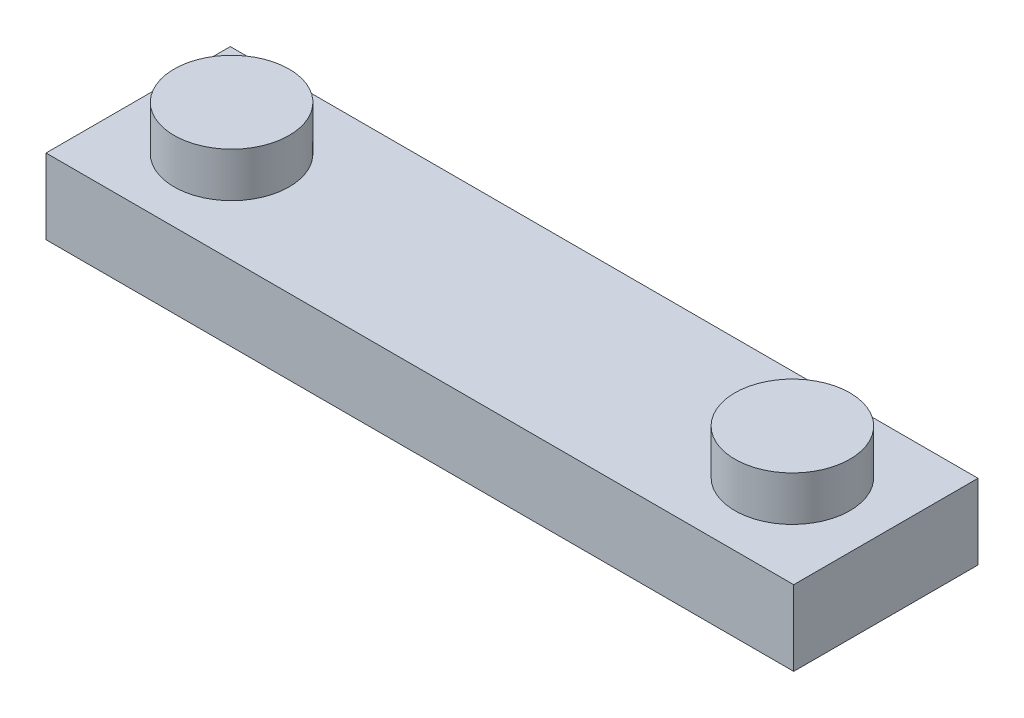
ISO-10303-21;
HEADER;
FILE_DESCRIPTION(('STEP AP214'),'2;1');
FILE_NAME('part.step','',(''),(''),'','','');
FILE_SCHEMA(('AUTOMOTIVE_DESIGN { 1 0 10303 214 1 1 1 1 }'));
ENDSEC;
DATA;
#1=APPLICATION_CONTEXT('core data for automotive mechanical design processes');
#2=APPLICATION_PROTOCOL_DEFINITION('international standard','automotive_design',2000,#1);
#3=PRODUCT_CONTEXT('',#1,'mechanical');
#4=PRODUCT('Part','Part','',(#3));
#5=PRODUCT_RELATED_PRODUCT_CATEGORY('part','',(#4));
#6=PRODUCT_DEFINITION_FORMATION('','',#4);
#7=PRODUCT_DEFINITION_CONTEXT('part definition',#1,'design');
#8=PRODUCT_DEFINITION('design','',#6,#7);
#9=PRODUCT_DEFINITION_SHAPE('','',#8);
#10=(LENGTH_UNIT() NAMED_UNIT(*) SI_UNIT(.MILLI.,.METRE.));
#11=(NAMED_UNIT(*) PLANE_ANGLE_UNIT() SI_UNIT($,.RADIAN.));
#12=(NAMED_UNIT(*) SI_UNIT($,.STERADIAN.) SOLID_ANGLE_UNIT());
#13=UNCERTAINTY_MEASURE_WITH_UNIT(LENGTH_MEASURE(1.E-05),#10,'distance_accuracy_value','');
#14=(GEOMETRIC_REPRESENTATION_CONTEXT(3) GLOBAL_UNCERTAINTY_ASSIGNED_CONTEXT((#13)) GLOBAL_UNIT_ASSIGNED_CONTEXT((#10,
#11,#12)) REPRESENTATION_CONTEXT('',''));
#15=CARTESIAN_POINT('',(0.,0.,0.));
#16=DIRECTION('',(0.,0.,1.));
#17=DIRECTION('',(1.,0.,0.));
#18=AXIS2_PLACEMENT_3D('',#15,#16,#17);
#19=CARTESIAN_POINT('',(15.925,-3.2,-3.925));
#20=DIRECTION('',(1.,0.,0.));
#21=DIRECTION('',(0.,0.,-1.));
#22=AXIS2_PLACEMENT_3D('',#19,#20,#21);
#23=PLANE('',#22);
#24=DIRECTION('',(0.,0.,-1.));
#25=VECTOR('',#24,1.);
#26=CARTESIAN_POINT('',(15.925,0.,-3.925));
#27=LINE('',#26,#25);
#28=CARTESIAN_POINT('',(15.925,0.,3.925));
#29=VERTEX_POINT('',#28);
#30=CARTESIAN_POINT('',(15.925,0.,-3.925));
#31=VERTEX_POINT('',#30);
#32=EDGE_CURVE('E171',#29,#31,#27,.T.);
#33=ORIENTED_EDGE('',*,*,#32,.F.);
#34=DIRECTION('',(0.,1.,0.));
#35=VECTOR('',#34,1.);
#36=CARTESIAN_POINT('',(15.925,-3.2,3.925));
#37=LINE('',#36,#35);
#38=CARTESIAN_POINT('',(15.925,-3.2,3.925));
#39=VERTEX_POINT('',#38);
#40=EDGE_CURVE('E58',#39,#29,#37,.T.);
#41=ORIENTED_EDGE('',*,*,#40,.F.);
#42=DIRECTION('',(0.,0.,-1.));
#43=VECTOR('',#42,1.);
#44=CARTESIAN_POINT('',(15.925,-3.2,-3.925));
#45=LINE('',#44,#43);
#46=CARTESIAN_POINT('',(15.925,-3.2,-3.925));
#47=VERTEX_POINT('',#46);
#48=EDGE_CURVE('E174',#39,#47,#45,.T.);
#49=ORIENTED_EDGE('',*,*,#48,.T.);
#50=DIRECTION('',(0.,1.,0.));
#51=VECTOR('',#50,1.);
#52=CARTESIAN_POINT('',(15.925,-3.2,-3.925));
#53=LINE('',#52,#51);
#54=EDGE_CURVE('E84',#47,#31,#53,.T.);
#55=ORIENTED_EDGE('',*,*,#54,.T.);
#56=EDGE_LOOP('',(#33,#41,#49,#55));
#57=FACE_BOUND('',#56,.T.);
#58=ADVANCED_FACE('F35',(#57),#23,.T.);
#59=CARTESIAN_POINT('',(-15.925,-3.2,3.925));
#60=DIRECTION('',(0.,0.,1.));
#61=DIRECTION('',(1.,0.,0.));
#62=AXIS2_PLACEMENT_3D('',#59,#60,#61);
#63=PLANE('',#62);
#64=DIRECTION('',(1.,0.,0.));
#65=VECTOR('',#64,1.);
#66=CARTESIAN_POINT('',(-15.925,0.,3.925));
#67=LINE('',#66,#65);
#68=CARTESIAN_POINT('',(-15.925,0.,3.925));
#69=VERTEX_POINT('',#68);
#70=EDGE_CURVE('E177',#69,#29,#67,.T.);
#71=ORIENTED_EDGE('',*,*,#70,.F.);
#72=DIRECTION('',(0.,1.,0.));
#73=VECTOR('',#72,1.);
#74=CARTESIAN_POINT('',(-15.925,-3.2,3.925));
#75=LINE('',#74,#73);
#76=CARTESIAN_POINT('',(-15.925,-3.2,3.925));
#77=VERTEX_POINT('',#76);
#78=EDGE_CURVE('E196',#77,#69,#75,.T.);
#79=ORIENTED_EDGE('',*,*,#78,.F.);
#80=DIRECTION('',(1.,0.,0.));
#81=VECTOR('',#80,1.);
#82=CARTESIAN_POINT('',(-15.925,-3.2,3.925));
#83=LINE('',#82,#81);
#84=EDGE_CURVE('E182',#77,#39,#83,.T.);
#85=ORIENTED_EDGE('',*,*,#84,.T.);
#86=ORIENTED_EDGE('',*,*,#40,.T.);
#87=EDGE_LOOP('',(#71,#79,#85,#86));
#88=FACE_BOUND('',#87,.T.);
#89=ADVANCED_FACE('F232',(#88),#63,.T.);
#90=CARTESIAN_POINT('',(-15.925,-3.2,-3.925));
#91=DIRECTION('',(-1.,0.,0.));
#92=DIRECTION('',(0.,0.,1.));
#93=AXIS2_PLACEMENT_3D('',#90,#91,#92);
#94=PLANE('',#93);
#95=DIRECTION('',(0.,0.,1.));
#96=VECTOR('',#95,1.);
#97=CARTESIAN_POINT('',(-15.925,0.,-3.925));
#98=LINE('',#97,#96);
#99=CARTESIAN_POINT('',(-15.925,0.,-3.925));
#100=VERTEX_POINT('',#99);
#101=EDGE_CURVE('E189',#100,#69,#98,.T.);
#102=ORIENTED_EDGE('',*,*,#101,.F.);
#103=DIRECTION('',(0.,1.,0.));
#104=VECTOR('',#103,1.);
#105=CARTESIAN_POINT('',(-15.925,-3.2,-3.925));
#106=LINE('',#105,#104);
#107=CARTESIAN_POINT('',(-15.925,-3.2,-3.925));
#108=VERTEX_POINT('',#107);
#109=EDGE_CURVE('E198',#108,#100,#106,.T.);
#110=ORIENTED_EDGE('',*,*,#109,.F.);
#111=DIRECTION('',(0.,0.,1.));
#112=VECTOR('',#111,1.);
#113=CARTESIAN_POINT('',(-15.925,-3.2,-3.925));
#114=LINE('',#113,#112);
#115=EDGE_CURVE('E179',#108,#77,#114,.T.);
#116=ORIENTED_EDGE('',*,*,#115,.T.);
#117=ORIENTED_EDGE('',*,*,#78,.T.);
#118=EDGE_LOOP('',(#102,#110,#116,#117));
#119=FACE_BOUND('',#118,.T.);
#120=ADVANCED_FACE('F236',(#119),#94,.T.);
#121=CARTESIAN_POINT('',(-15.925,-3.2,-3.925));
#122=DIRECTION('',(0.,0.,-1.));
#123=DIRECTION('',(-1.,0.,0.));
#124=AXIS2_PLACEMENT_3D('',#121,#122,#123);
#125=PLANE('',#124);
#126=DIRECTION('',(-1.,0.,0.));
#127=VECTOR('',#126,1.);
#128=CARTESIAN_POINT('',(-15.925,0.,-3.925));
#129=LINE('',#128,#127);
#130=EDGE_CURVE('E186',#31,#100,#129,.T.);
#131=ORIENTED_EDGE('',*,*,#130,.F.);
#132=ORIENTED_EDGE('',*,*,#54,.F.);
#133=DIRECTION('',(-1.,0.,0.));
#134=VECTOR('',#133,1.);
#135=CARTESIAN_POINT('',(-15.925,-3.2,-3.925));
#136=LINE('',#135,#134);
#137=EDGE_CURVE('E176',#47,#108,#136,.T.);
#138=ORIENTED_EDGE('',*,*,#137,.T.);
#139=ORIENTED_EDGE('',*,*,#109,.T.);
#140=EDGE_LOOP('',(#131,#132,#138,#139));
#141=FACE_BOUND('',#140,.T.);
#142=ADVANCED_FACE('F246',(#141),#125,.T.);
#143=CARTESIAN_POINT('',(0.,-3.2,0.));
#144=DIRECTION('',(0.,1.,0.));
#145=DIRECTION('',(0.,0.,1.));
#146=AXIS2_PLACEMENT_3D('',#143,#144,#145);
#147=PLANE('',#146);
#148=DIRECTION('',(1.,0.,0.));
#149=VECTOR('',#148,1.);
#150=CARTESIAN_POINT('',(0.,-3.2,2.425));
#151=LINE('',#150,#149);
#152=CARTESIAN_POINT('',(-14.425,-3.2,2.425));
#153=VERTEX_POINT('',#152);
#154=CARTESIAN_POINT('',(14.425,-3.2,2.425));
#155=VERTEX_POINT('',#154);
#156=EDGE_CURVE('E157',#153,#155,#151,.T.);
#157=ORIENTED_EDGE('',*,*,#156,.T.);
#158=DIRECTION('',(0.,0.,-1.));
#159=VECTOR('',#158,1.);
#160=CARTESIAN_POINT('',(14.425,-3.2,0.));
#161=LINE('',#160,#159);
#162=CARTESIAN_POINT('',(14.425,-3.2,-2.425));
#163=VERTEX_POINT('',#162);
#164=EDGE_CURVE('E113',#155,#163,#161,.T.);
#165=ORIENTED_EDGE('',*,*,#164,.T.);
#166=DIRECTION('',(-1.,0.,0.));
#167=VECTOR('',#166,1.);
#168=CARTESIAN_POINT('',(0.,-3.2,-2.425));
#169=LINE('',#168,#167);
#170=CARTESIAN_POINT('',(-14.425,-3.2,-2.425));
#171=VERTEX_POINT('',#170);
#172=EDGE_CURVE('E135',#163,#171,#169,.T.);
#173=ORIENTED_EDGE('',*,*,#172,.T.);
#174=DIRECTION('',(0.,0.,1.));
#175=VECTOR('',#174,1.);
#176=CARTESIAN_POINT('',(-14.425,-3.2,0.));
#177=LINE('',#176,#175);
#178=EDGE_CURVE('E49',#171,#153,#177,.T.);
#179=ORIENTED_EDGE('',*,*,#178,.T.);
#180=EDGE_LOOP('',(#157,#165,#173,#179));
#181=FACE_BOUND('',#180,.T.);
#182=ORIENTED_EDGE('',*,*,#48,.F.);
#183=ORIENTED_EDGE('',*,*,#84,.F.);
#184=ORIENTED_EDGE('',*,*,#115,.F.);
#185=ORIENTED_EDGE('',*,*,#137,.F.);
#186=EDGE_LOOP('',(#182,#183,#184,#185));
#187=FACE_BOUND('',#186,.T.);
#188=ADVANCED_FACE('F245',(#181,#187),#147,.F.);
#189=CARTESIAN_POINT('',(0.,0.,0.));
#190=DIRECTION('',(0.,1.,0.));
#191=DIRECTION('',(0.,0.,1.));
#192=AXIS2_PLACEMENT_3D('',#189,#190,#191);
#193=PLANE('',#192);
#194=CARTESIAN_POINT('',(-11.94375,0.,0.));
#195=DIRECTION('',(0.,1.,0.));
#196=DIRECTION('',(0.,0.,1.));
#197=AXIS2_PLACEMENT_3D('',#194,#195,#196);
#198=CIRCLE('',#197,2.45);
#199=CARTESIAN_POINT('',(-11.94375,0.,-2.45));
#200=VERTEX_POINT('',#199);
#201=EDGE_CURVE('E118',#200,#200,#198,.T.);
#202=ORIENTED_EDGE('',*,*,#201,.F.);
#203=EDGE_LOOP('',(#202));
#204=FACE_BOUND('',#203,.T.);
#205=CARTESIAN_POINT('',(11.94375,0.,0.));
#206=DIRECTION('',(0.,1.,0.));
#207=DIRECTION('',(0.,0.,1.));
#208=AXIS2_PLACEMENT_3D('',#205,#206,#207);
#209=CIRCLE('',#208,2.45);
#210=CARTESIAN_POINT('',(11.94375,0.,-2.45));
#211=VERTEX_POINT('',#210);
#212=EDGE_CURVE('E165',#211,#211,#209,.T.);
#213=ORIENTED_EDGE('',*,*,#212,.F.);
#214=EDGE_LOOP('',(#213));
#215=FACE_BOUND('',#214,.T.);
#216=ORIENTED_EDGE('',*,*,#32,.T.);
#217=ORIENTED_EDGE('',*,*,#130,.T.);
#218=ORIENTED_EDGE('',*,*,#101,.T.);
#219=ORIENTED_EDGE('',*,*,#70,.T.);
#220=EDGE_LOOP('',(#216,#217,#218,#219));
#221=FACE_BOUND('',#220,.T.);
#222=ADVANCED_FACE('F239',(#204,#215,#221),#193,.T.);
#223=CARTESIAN_POINT('',(11.94375,1.9,0.));
#224=DIRECTION('',(0.,-1.,0.));
#225=DIRECTION('',(0.,0.,-1.));
#226=AXIS2_PLACEMENT_3D('',#223,#224,#225);
#227=CYLINDRICAL_SURFACE('',#226,2.45);
#228=CARTESIAN_POINT('',(11.94375,1.9,0.));
#229=DIRECTION('',(0.,1.,0.));
#230=DIRECTION('',(0.,0.,1.));
#231=AXIS2_PLACEMENT_3D('',#228,#229,#230);
#232=CIRCLE('',#231,2.45);
#233=CARTESIAN_POINT('',(11.94375,1.9,-2.45));
#234=VERTEX_POINT('',#233);
#235=EDGE_CURVE('E168',#234,#234,#232,.T.);
#236=CARTESIAN_POINT('',(11.94375,1.9,-2.45));
#237=CARTESIAN_POINT('',(11.94375,1.88020833333333,-2.45));
#238=CARTESIAN_POINT('',(11.94375,1.86041666666667,-2.45));
#239=CARTESIAN_POINT('',(11.94375,1.82083333333333,-2.45));
#240=CARTESIAN_POINT('',(11.94375,1.80104166666667,-2.45));
#241=CARTESIAN_POINT('',(11.94375,1.76145833333333,-2.45));
#242=CARTESIAN_POINT('',(11.94375,1.74166666666667,-2.45));
#243=CARTESIAN_POINT('',(11.94375,1.70208333333333,-2.45));
#244=CARTESIAN_POINT('',(11.94375,1.68229166666667,-2.45));
#245=CARTESIAN_POINT('',(11.94375,1.64270833333333,-2.45));
#246=CARTESIAN_POINT('',(11.94375,1.62291666666667,-2.45));
#247=CARTESIAN_POINT('',(11.94375,1.58333333333333,-2.45));
#248=CARTESIAN_POINT('',(11.94375,1.56354166666667,-2.45));
#249=CARTESIAN_POINT('',(11.94375,1.52395833333333,-2.45));
#250=CARTESIAN_POINT('',(11.94375,1.50416666666667,-2.45));
#251=CARTESIAN_POINT('',(11.94375,1.46458333333333,-2.45));
#252=CARTESIAN_POINT('',(11.94375,1.44479166666667,-2.45));
#253=CARTESIAN_POINT('',(11.94375,1.40520833333333,-2.45));
#254=CARTESIAN_POINT('',(11.94375,1.38541666666667,-2.45));
#255=CARTESIAN_POINT('',(11.94375,1.34583333333333,-2.45));
#256=CARTESIAN_POINT('',(11.94375,1.32604166666667,-2.45));
#257=CARTESIAN_POINT('',(11.94375,1.28645833333333,-2.45));
#258=CARTESIAN_POINT('',(11.94375,1.26666666666667,-2.45));
#259=CARTESIAN_POINT('',(11.94375,1.22708333333333,-2.45));
#260=CARTESIAN_POINT('',(11.94375,1.20729166666667,-2.45));
#261=CARTESIAN_POINT('',(11.94375,1.16770833333333,-2.45));
#262=CARTESIAN_POINT('',(11.94375,1.14791666666667,-2.45));
#263=CARTESIAN_POINT('',(11.94375,1.10833333333333,-2.45));
#264=CARTESIAN_POINT('',(11.94375,1.08854166666667,-2.45));
#265=CARTESIAN_POINT('',(11.94375,1.04895833333333,-2.45));
#266=CARTESIAN_POINT('',(11.94375,1.02916666666667,-2.45));
#267=CARTESIAN_POINT('',(11.94375,0.989583333333333,-2.45));
#268=CARTESIAN_POINT('',(11.94375,0.969791666666666,-2.45));
#269=CARTESIAN_POINT('',(11.94375,0.930208333333333,-2.45));
#270=CARTESIAN_POINT('',(11.94375,0.910416666666666,-2.45));
#271=CARTESIAN_POINT('',(11.94375,0.870833333333333,-2.45));
#272=CARTESIAN_POINT('',(11.94375,0.851041666666666,-2.45));
#273=CARTESIAN_POINT('',(11.94375,0.811458333333333,-2.45));
#274=CARTESIAN_POINT('',(11.94375,0.791666666666666,-2.45));
#275=CARTESIAN_POINT('',(11.94375,0.752083333333333,-2.45));
#276=CARTESIAN_POINT('',(11.94375,0.732291666666666,-2.45));
#277=CARTESIAN_POINT('',(11.94375,0.692708333333333,-2.45));
#278=CARTESIAN_POINT('',(11.94375,0.672916666666666,-2.45));
#279=CARTESIAN_POINT('',(11.94375,0.633333333333333,-2.45));
#280=CARTESIAN_POINT('',(11.94375,0.613541666666667,-2.45));
#281=CARTESIAN_POINT('',(11.94375,0.573958333333333,-2.45));
#282=CARTESIAN_POINT('',(11.94375,0.554166666666667,-2.45));
#283=CARTESIAN_POINT('',(11.94375,0.514583333333333,-2.45));
#284=CARTESIAN_POINT('',(11.94375,0.494791666666667,-2.45));
#285=CARTESIAN_POINT('',(11.94375,0.455208333333333,-2.45));
#286=CARTESIAN_POINT('',(11.94375,0.435416666666667,-2.45));
#287=CARTESIAN_POINT('',(11.94375,0.395833333333333,-2.45));
#288=CARTESIAN_POINT('',(11.94375,0.376041666666667,-2.45));
#289=CARTESIAN_POINT('',(11.94375,0.336458333333333,-2.45));
#290=CARTESIAN_POINT('',(11.94375,0.316666666666667,-2.45));
#291=CARTESIAN_POINT('',(11.94375,0.277083333333333,-2.45));
#292=CARTESIAN_POINT('',(11.94375,0.257291666666667,-2.45));
#293=CARTESIAN_POINT('',(11.94375,0.217708333333333,-2.45));
#294=CARTESIAN_POINT('',(11.94375,0.197916666666667,-2.45));
#295=CARTESIAN_POINT('',(11.94375,0.158333333333333,-2.45));
#296=CARTESIAN_POINT('',(11.94375,0.138541666666667,-2.45));
#297=CARTESIAN_POINT('',(11.94375,0.0989583333333333,-2.45));
#298=CARTESIAN_POINT('',(11.94375,0.0791666666666666,-2.45));
#299=CARTESIAN_POINT('',(11.94375,0.0395833333333333,-2.45));
#300=CARTESIAN_POINT('',(11.94375,0.0197916666666666,-2.45));
#301=CARTESIAN_POINT('',(11.94375,0.,-2.45));
#302=B_SPLINE_CURVE_WITH_KNOTS('',3,(#236,#237,#238,#239,#240,#241,#242,#243,#244,#245,#246,
#247,#248,#249,#250,#251,#252,#253,#254,#255,#256,#257,#258,#259,#260,#261,#262,#263,#264,#265,
#266,#267,#268,#269,#270,#271,#272,#273,#274,#275,#276,#277,#278,#279,#280,#281,#282,#283,#284,
#285,#286,#287,#288,#289,#290,#291,#292,#293,#294,#295,#296,#297,#298,#299,#300,#301),
.UNSPECIFIED.,.F.,.F.,(4,2,2,2,2,2,2,2,2,2,2,2,2,2,2,2,2,2,2,2,2,2,2,2,2,2,2,2,2,2,2,2,4),(0.,
0.059375,0.11875,0.178125,0.2375,0.296875,0.35625,0.415625,0.475,0.534375,0.59375,0.653125,
0.7125,0.771875,0.831249999999999,0.890624999999999,0.95,1.009375,1.06875,1.128125,1.1875,
1.246875,1.30625,1.365625,1.425,1.484375,1.54375,1.603125,1.6625,1.721875,1.78125,1.840625,1.9),.UNSPECIFIED.);
#303=EDGE_CURVE('BSEAM257',#234,#211,#302,.T.);
#304=ORIENTED_EDGE('',*,*,#235,.F.);
#305=ORIENTED_EDGE('',*,*,#212,.T.);
#306=ORIENTED_EDGE('',*,*,#303,.T.);
#307=ORIENTED_EDGE('',*,*,#303,.F.);
#308=EDGE_LOOP('',(#304,#306,#305,#307));
#309=FACE_BOUND('',#308,.T.);
#310=ADVANCED_FACE('F257',(#309),#227,.T.);
#311=CARTESIAN_POINT('',(11.94375,1.9,0.));
#312=DIRECTION('',(0.,1.,0.));
#313=DIRECTION('',(0.,0.,1.));
#314=AXIS2_PLACEMENT_3D('',#311,#312,#313);
#315=PLANE('',#314);
#316=ORIENTED_EDGE('',*,*,#235,.T.);
#317=EDGE_LOOP('',(#316));
#318=FACE_BOUND('',#317,.T.);
#319=ADVANCED_FACE('F262',(#318),#315,.T.);
#320=CARTESIAN_POINT('',(-11.94375,1.9,0.));
#321=DIRECTION('',(0.,-1.,0.));
#322=DIRECTION('',(0.,0.,-1.));
#323=AXIS2_PLACEMENT_3D('',#320,#321,#322);
#324=CYLINDRICAL_SURFACE('',#323,2.45);
#325=CARTESIAN_POINT('',(-11.94375,1.9,0.));
#326=DIRECTION('',(0.,1.,0.));
#327=DIRECTION('',(0.,0.,1.));
#328=AXIS2_PLACEMENT_3D('',#325,#326,#327);
#329=CIRCLE('',#328,2.45);
#330=CARTESIAN_POINT('',(-11.94375,1.9,-2.45));
#331=VERTEX_POINT('',#330);
#332=EDGE_CURVE('E162',#331,#331,#329,.T.);
#333=CARTESIAN_POINT('',(-11.94375,1.9,-2.45));
#334=CARTESIAN_POINT('',(-11.94375,1.88020833333333,-2.45));
#335=CARTESIAN_POINT('',(-11.94375,1.86041666666667,-2.45));
#336=CARTESIAN_POINT('',(-11.94375,1.82083333333333,-2.45));
#337=CARTESIAN_POINT('',(-11.94375,1.80104166666667,-2.45));
#338=CARTESIAN_POINT('',(-11.94375,1.76145833333333,-2.45));
#339=CARTESIAN_POINT('',(-11.94375,1.74166666666667,-2.45));
#340=CARTESIAN_POINT('',(-11.94375,1.70208333333333,-2.45));
#341=CARTESIAN_POINT('',(-11.94375,1.68229166666667,-2.45));
#342=CARTESIAN_POINT('',(-11.94375,1.64270833333333,-2.45));
#343=CARTESIAN_POINT('',(-11.94375,1.62291666666667,-2.45));
#344=CARTESIAN_POINT('',(-11.94375,1.58333333333333,-2.45));
#345=CARTESIAN_POINT('',(-11.94375,1.56354166666667,-2.45));
#346=CARTESIAN_POINT('',(-11.94375,1.52395833333333,-2.45));
#347=CARTESIAN_POINT('',(-11.94375,1.50416666666667,-2.45));
#348=CARTESIAN_POINT('',(-11.94375,1.46458333333333,-2.45));
#349=CARTESIAN_POINT('',(-11.94375,1.44479166666667,-2.45));
#350=CARTESIAN_POINT('',(-11.94375,1.40520833333333,-2.45));
#351=CARTESIAN_POINT('',(-11.94375,1.38541666666667,-2.45));
#352=CARTESIAN_POINT('',(-11.94375,1.34583333333333,-2.45));
#353=CARTESIAN_POINT('',(-11.94375,1.32604166666667,-2.45));
#354=CARTESIAN_POINT('',(-11.94375,1.28645833333333,-2.45));
#355=CARTESIAN_POINT('',(-11.94375,1.26666666666667,-2.45));
#356=CARTESIAN_POINT('',(-11.94375,1.22708333333333,-2.45));
#357=CARTESIAN_POINT('',(-11.94375,1.20729166666667,-2.45));
#358=CARTESIAN_POINT('',(-11.94375,1.16770833333333,-2.45));
#359=CARTESIAN_POINT('',(-11.94375,1.14791666666667,-2.45));
#360=CARTESIAN_POINT('',(-11.94375,1.10833333333333,-2.45));
#361=CARTESIAN_POINT('',(-11.94375,1.08854166666667,-2.45));
#362=CARTESIAN_POINT('',(-11.94375,1.04895833333333,-2.45));
#363=CARTESIAN_POINT('',(-11.94375,1.02916666666667,-2.45));
#364=CARTESIAN_POINT('',(-11.94375,0.989583333333333,-2.45));
#365=CARTESIAN_POINT('',(-11.94375,0.969791666666666,-2.45));
#366=CARTESIAN_POINT('',(-11.94375,0.930208333333333,-2.45));
#367=CARTESIAN_POINT('',(-11.94375,0.910416666666666,-2.45));
#368=CARTESIAN_POINT('',(-11.94375,0.870833333333333,-2.45));
#369=CARTESIAN_POINT('',(-11.94375,0.851041666666666,-2.45));
#370=CARTESIAN_POINT('',(-11.94375,0.811458333333333,-2.45));
#371=CARTESIAN_POINT('',(-11.94375,0.791666666666666,-2.45));
#372=CARTESIAN_POINT('',(-11.94375,0.752083333333333,-2.45));
#373=CARTESIAN_POINT('',(-11.94375,0.732291666666666,-2.45));
#374=CARTESIAN_POINT('',(-11.94375,0.692708333333333,-2.45));
#375=CARTESIAN_POINT('',(-11.94375,0.672916666666666,-2.45));
#376=CARTESIAN_POINT('',(-11.94375,0.633333333333333,-2.45));
#377=CARTESIAN_POINT('',(-11.94375,0.613541666666667,-2.45));
#378=CARTESIAN_POINT('',(-11.94375,0.573958333333333,-2.45));
#379=CARTESIAN_POINT('',(-11.94375,0.554166666666667,-2.45));
#380=CARTESIAN_POINT('',(-11.94375,0.514583333333333,-2.45));
#381=CARTESIAN_POINT('',(-11.94375,0.494791666666667,-2.45));
#382=CARTESIAN_POINT('',(-11.94375,0.455208333333333,-2.45));
#383=CARTESIAN_POINT('',(-11.94375,0.435416666666667,-2.45));
#384=CARTESIAN_POINT('',(-11.94375,0.395833333333333,-2.45));
#385=CARTESIAN_POINT('',(-11.94375,0.376041666666667,-2.45));
#386=CARTESIAN_POINT('',(-11.94375,0.336458333333333,-2.45));
#387=CARTESIAN_POINT('',(-11.94375,0.316666666666667,-2.45));
#388=CARTESIAN_POINT('',(-11.94375,0.277083333333333,-2.45));
#389=CARTESIAN_POINT('',(-11.94375,0.257291666666667,-2.45));
#390=CARTESIAN_POINT('',(-11.94375,0.217708333333333,-2.45));
#391=CARTESIAN_POINT('',(-11.94375,0.197916666666667,-2.45));
#392=CARTESIAN_POINT('',(-11.94375,0.158333333333333,-2.45));
#393=CARTESIAN_POINT('',(-11.94375,0.138541666666667,-2.45));
#394=CARTESIAN_POINT('',(-11.94375,0.0989583333333333,-2.45));
#395=CARTESIAN_POINT('',(-11.94375,0.0791666666666666,-2.45));
#396=CARTESIAN_POINT('',(-11.94375,0.0395833333333333,-2.45));
#397=CARTESIAN_POINT('',(-11.94375,0.0197916666666666,-2.45));
#398=CARTESIAN_POINT('',(-11.94375,0.,-2.45));
#399=B_SPLINE_CURVE_WITH_KNOTS('',3,(#333,#334,#335,#336,#337,#338,#339,#340,#341,#342,#343,
#344,#345,#346,#347,#348,#349,#350,#351,#352,#353,#354,#355,#356,#357,#358,#359,#360,#361,#362,
#363,#364,#365,#366,#367,#368,#369,#370,#371,#372,#373,#374,#375,#376,#377,#378,#379,#380,#381,
#382,#383,#384,#385,#386,#387,#388,#389,#390,#391,#392,#393,#394,#395,#396,#397,#398),
.UNSPECIFIED.,.F.,.F.,(4,2,2,2,2,2,2,2,2,2,2,2,2,2,2,2,2,2,2,2,2,2,2,2,2,2,2,2,2,2,2,2,4),(0.,
0.059375,0.11875,0.178125,0.2375,0.296875,0.35625,0.415625,0.475,0.534375,0.59375,0.653125,
0.7125,0.771875,0.831249999999999,0.890624999999999,0.95,1.009375,1.06875,1.128125,1.1875,
1.246875,1.30625,1.365625,1.425,1.484375,1.54375,1.603125,1.6625,1.721875,1.78125,1.840625,1.9),.UNSPECIFIED.);
#400=EDGE_CURVE('BSEAM266',#331,#200,#399,.T.);
#401=ORIENTED_EDGE('',*,*,#332,.F.);
#402=ORIENTED_EDGE('',*,*,#201,.T.);
#403=ORIENTED_EDGE('',*,*,#400,.T.);
#404=ORIENTED_EDGE('',*,*,#400,.F.);
#405=EDGE_LOOP('',(#401,#403,#402,#404));
#406=FACE_BOUND('',#405,.T.);
#407=ADVANCED_FACE('F266',(#406),#324,.T.);
#408=CARTESIAN_POINT('',(-11.94375,1.9,0.));
#409=DIRECTION('',(0.,1.,0.));
#410=DIRECTION('',(0.,0.,1.));
#411=AXIS2_PLACEMENT_3D('',#408,#409,#410);
#412=PLANE('',#411);
#413=ORIENTED_EDGE('',*,*,#332,.T.);
#414=EDGE_LOOP('',(#413));
#415=FACE_BOUND('',#414,.T.);
#416=ADVANCED_FACE('F270',(#415),#412,.T.);
#417=CARTESIAN_POINT('',(14.425,-3.2,-3.925));
#418=DIRECTION('',(1.,0.,0.));
#419=DIRECTION('',(0.,0.,-1.));
#420=AXIS2_PLACEMENT_3D('',#417,#418,#419);
#421=PLANE('',#420);
#422=DIRECTION('',(0.,0.,-1.));
#423=VECTOR('',#422,1.);
#424=CARTESIAN_POINT('',(14.425,-1.5,0.));
#425=LINE('',#424,#423);
#426=CARTESIAN_POINT('',(14.425,-1.5,2.425));
#427=VERTEX_POINT('',#426);
#428=CARTESIAN_POINT('',(14.425,-1.5,-2.425));
#429=VERTEX_POINT('',#428);
#430=EDGE_CURVE('E111',#427,#429,#425,.T.);
#431=ORIENTED_EDGE('',*,*,#430,.T.);
#432=DIRECTION('',(0.,1.,0.));
#433=VECTOR('',#432,1.);
#434=CARTESIAN_POINT('',(14.425,-3.2,-2.425));
#435=LINE('',#434,#433);
#436=EDGE_CURVE('E140',#163,#429,#435,.T.);
#437=ORIENTED_EDGE('',*,*,#436,.F.);
#438=ORIENTED_EDGE('',*,*,#164,.F.);
#439=DIRECTION('',(0.,1.,0.));
#440=VECTOR('',#439,1.);
#441=CARTESIAN_POINT('',(14.425,-3.2,2.425));
#442=LINE('',#441,#440);
#443=EDGE_CURVE('E108',#155,#427,#442,.T.);
#444=ORIENTED_EDGE('',*,*,#443,.T.);
#445=EDGE_LOOP('',(#431,#437,#438,#444));
#446=FACE_BOUND('',#445,.T.);
#447=ADVANCED_FACE('F110',(#446),#421,.F.);
#448=CARTESIAN_POINT('',(-15.925,-3.2,2.425));
#449=DIRECTION('',(0.,0.,1.));
#450=DIRECTION('',(1.,0.,0.));
#451=AXIS2_PLACEMENT_3D('',#448,#449,#450);
#452=PLANE('',#451);
#453=DIRECTION('',(1.,0.,0.));
#454=VECTOR('',#453,1.);
#455=CARTESIAN_POINT('',(0.,-1.5,2.425));
#456=LINE('',#455,#454);
#457=CARTESIAN_POINT('',(-14.425,-1.5,2.425));
#458=VERTEX_POINT('',#457);
#459=EDGE_CURVE('E126',#458,#427,#456,.T.);
#460=ORIENTED_EDGE('',*,*,#459,.T.);
#461=ORIENTED_EDGE('',*,*,#443,.F.);
#462=ORIENTED_EDGE('',*,*,#156,.F.);
#463=DIRECTION('',(0.,1.,0.));
#464=VECTOR('',#463,1.);
#465=CARTESIAN_POINT('',(-14.425,-3.2,2.425));
#466=LINE('',#465,#464);
#467=EDGE_CURVE('E119',#153,#458,#466,.T.);
#468=ORIENTED_EDGE('',*,*,#467,.T.);
#469=EDGE_LOOP('',(#460,#461,#462,#468));
#470=FACE_BOUND('',#469,.T.);
#471=ADVANCED_FACE('F131',(#470),#452,.F.);
#472=CARTESIAN_POINT('',(-14.425,-3.2,-3.925));
#473=DIRECTION('',(-1.,0.,0.));
#474=DIRECTION('',(0.,0.,1.));
#475=AXIS2_PLACEMENT_3D('',#472,#473,#474);
#476=PLANE('',#475);
#477=DIRECTION('',(0.,0.,1.));
#478=VECTOR('',#477,1.);
#479=CARTESIAN_POINT('',(-14.425,-1.5,0.));
#480=LINE('',#479,#478);
#481=CARTESIAN_POINT('',(-14.425,-1.5,-2.425));
#482=VERTEX_POINT('',#481);
#483=EDGE_CURVE('E133',#482,#458,#480,.T.);
#484=ORIENTED_EDGE('',*,*,#483,.T.);
#485=ORIENTED_EDGE('',*,*,#467,.F.);
#486=ORIENTED_EDGE('',*,*,#178,.F.);
#487=DIRECTION('',(0.,1.,0.));
#488=VECTOR('',#487,1.);
#489=CARTESIAN_POINT('',(-14.425,-3.2,-2.425));
#490=LINE('',#489,#488);
#491=EDGE_CURVE('E141',#171,#482,#490,.T.);
#492=ORIENTED_EDGE('',*,*,#491,.T.);
#493=EDGE_LOOP('',(#484,#485,#486,#492));
#494=FACE_BOUND('',#493,.T.);
#495=ADVANCED_FACE('F430',(#494),#476,.F.);
#496=CARTESIAN_POINT('',(-15.925,-3.2,-2.425));
#497=DIRECTION('',(0.,0.,-1.));
#498=DIRECTION('',(-1.,0.,0.));
#499=AXIS2_PLACEMENT_3D('',#496,#497,#498);
#500=PLANE('',#499);
#501=DIRECTION('',(-1.,0.,0.));
#502=VECTOR('',#501,1.);
#503=CARTESIAN_POINT('',(0.,-1.5,-2.425));
#504=LINE('',#503,#502);
#505=EDGE_CURVE('E128',#429,#482,#504,.T.);
#506=ORIENTED_EDGE('',*,*,#505,.T.);
#507=ORIENTED_EDGE('',*,*,#491,.F.);
#508=ORIENTED_EDGE('',*,*,#172,.F.);
#509=ORIENTED_EDGE('',*,*,#436,.T.);
#510=EDGE_LOOP('',(#506,#507,#508,#509));
#511=FACE_BOUND('',#510,.T.);
#512=ADVANCED_FACE('F210',(#511),#500,.F.);
#513=CARTESIAN_POINT('',(0.,-1.5,0.));
#514=DIRECTION('',(0.,1.,0.));
#515=DIRECTION('',(0.,0.,1.));
#516=AXIS2_PLACEMENT_3D('',#513,#514,#515);
#517=PLANE('',#516);
#518=CARTESIAN_POINT('',(7.9625,-1.5,0.));
#519=DIRECTION('',(0.,1.,0.));
#520=DIRECTION('',(0.,0.,1.));
#521=AXIS2_PLACEMENT_3D('',#518,#519,#520);
#522=CIRCLE('',#521,1.5);
#523=CARTESIAN_POINT('',(7.9625,-1.5,1.5));
#524=VERTEX_POINT('',#523);
#525=EDGE_CURVE('E12',#524,#524,#522,.F.);
#526=ORIENTED_EDGE('',*,*,#525,.F.);
#527=EDGE_LOOP('',(#526));
#528=FACE_BOUND('',#527,.T.);
#529=CARTESIAN_POINT('',(0.,-1.5,0.));
#530=DIRECTION('',(0.,1.,0.));
#531=DIRECTION('',(0.,0.,1.));
#532=AXIS2_PLACEMENT_3D('',#529,#530,#531);
#533=CIRCLE('',#532,1.5);
#534=CARTESIAN_POINT('',(0.,-1.5,1.5));
#535=VERTEX_POINT('',#534);
#536=EDGE_CURVE('E42',#535,#535,#533,.F.);
#537=ORIENTED_EDGE('',*,*,#536,.F.);
#538=EDGE_LOOP('',(#537));
#539=FACE_BOUND('',#538,.T.);
#540=CARTESIAN_POINT('',(-7.9625,-1.5,0.));
#541=DIRECTION('',(0.,1.,0.));
#542=DIRECTION('',(0.,0.,1.));
#543=AXIS2_PLACEMENT_3D('',#540,#541,#542);
#544=CIRCLE('',#543,1.5);
#545=CARTESIAN_POINT('',(-7.9625,-1.5,1.5));
#546=VERTEX_POINT('',#545);
#547=EDGE_CURVE('E195',#546,#546,#544,.F.);
#548=ORIENTED_EDGE('',*,*,#547,.F.);
#549=EDGE_LOOP('',(#548));
#550=FACE_BOUND('',#549,.T.);
#551=CARTESIAN_POINT('',(-11.94375,-1.5,0.));
#552=DIRECTION('',(0.,1.,0.));
#553=DIRECTION('',(0.,0.,1.));
#554=AXIS2_PLACEMENT_3D('',#551,#552,#553);
#555=CIRCLE('',#554,0.950000000000001);
#556=CARTESIAN_POINT('',(-11.94375,-1.5,-0.950000000000001));
#557=VERTEX_POINT('',#556);
#558=EDGE_CURVE('E145',#557,#557,#555,.T.);
#559=ORIENTED_EDGE('',*,*,#558,.T.);
#560=EDGE_LOOP('',(#559));
#561=FACE_BOUND('',#560,.T.);
#562=CARTESIAN_POINT('',(11.94375,-1.5,0.));
#563=DIRECTION('',(0.,1.,0.));
#564=DIRECTION('',(0.,0.,1.));
#565=AXIS2_PLACEMENT_3D('',#562,#563,#564);
#566=CIRCLE('',#565,0.950000000000001);
#567=CARTESIAN_POINT('',(11.94375,-1.5,-0.950000000000001));
#568=VERTEX_POINT('',#567);
#569=EDGE_CURVE('E150',#568,#568,#566,.T.);
#570=ORIENTED_EDGE('',*,*,#569,.T.);
#571=EDGE_LOOP('',(#570));
#572=FACE_BOUND('',#571,.T.);
#573=ORIENTED_EDGE('',*,*,#430,.F.);
#574=ORIENTED_EDGE('',*,*,#459,.F.);
#575=ORIENTED_EDGE('',*,*,#483,.F.);
#576=ORIENTED_EDGE('',*,*,#505,.F.);
#577=EDGE_LOOP('',(#573,#574,#575,#576));
#578=FACE_BOUND('',#577,.T.);
#579=ADVANCED_FACE('F124',(#528,#539,#550,#561,#572,#578),#517,.F.);
#580=CARTESIAN_POINT('',(11.94375,1.9,0.));
#581=DIRECTION('',(0.,-1.,0.));
#582=DIRECTION('',(0.,0.,-1.));
#583=AXIS2_PLACEMENT_3D('',#580,#581,#582);
#584=CYLINDRICAL_SURFACE('',#583,0.950000000000001);
#585=CARTESIAN_POINT('',(11.94375,0.4,0.));
#586=DIRECTION('',(0.,1.,0.));
#587=DIRECTION('',(0.,0.,1.));
#588=AXIS2_PLACEMENT_3D('',#585,#586,#587);
#589=CIRCLE('',#588,0.950000000000001);
#590=CARTESIAN_POINT('',(11.94375,0.399999999999999,-0.950000000000001));
#591=VERTEX_POINT('',#590);
#592=EDGE_CURVE('E129',#591,#591,#589,.T.);
#593=CARTESIAN_POINT('',(11.94375,0.399999999999999,-0.950000000000001));
#594=CARTESIAN_POINT('',(11.94375,0.380208333333333,-0.950000000000001));
#595=CARTESIAN_POINT('',(11.94375,0.360416666666666,-0.950000000000001));
#596=CARTESIAN_POINT('',(11.94375,0.320833333333333,-0.950000000000001));
#597=CARTESIAN_POINT('',(11.94375,0.301041666666666,-0.950000000000001));
#598=CARTESIAN_POINT('',(11.94375,0.261458333333333,-0.950000000000001));
#599=CARTESIAN_POINT('',(11.94375,0.241666666666666,-0.950000000000001));
#600=CARTESIAN_POINT('',(11.94375,0.202083333333333,-0.950000000000001));
#601=CARTESIAN_POINT('',(11.94375,0.182291666666666,-0.950000000000001));
#602=CARTESIAN_POINT('',(11.94375,0.142708333333333,-0.950000000000001));
#603=CARTESIAN_POINT('',(11.94375,0.122916666666666,-0.950000000000001));
#604=CARTESIAN_POINT('',(11.94375,0.0833333333333328,-0.950000000000001));
#605=CARTESIAN_POINT('',(11.94375,0.063541666666666,-0.950000000000001));
#606=CARTESIAN_POINT('',(11.94375,0.0239583333333326,-0.950000000000001));
#607=CARTESIAN_POINT('',(11.94375,0.00416666666666599,-0.950000000000001));
#608=CARTESIAN_POINT('',(11.94375,-0.0354166666666672,-0.950000000000001));
#609=CARTESIAN_POINT('',(11.94375,-0.0552083333333337,-0.950000000000001));
#610=CARTESIAN_POINT('',(11.94375,-0.094791666666667,-0.950000000000001));
#611=CARTESIAN_POINT('',(11.94375,-0.114583333333334,-0.950000000000001));
#612=CARTESIAN_POINT('',(11.94375,-0.154166666666667,-0.950000000000001));
#613=CARTESIAN_POINT('',(11.94375,-0.173958333333334,-0.950000000000001));
#614=CARTESIAN_POINT('',(11.94375,-0.213541666666667,-0.950000000000001));
#615=CARTESIAN_POINT('',(11.94375,-0.233333333333334,-0.950000000000001));
#616=CARTESIAN_POINT('',(11.94375,-0.272916666666667,-0.950000000000001));
#617=CARTESIAN_POINT('',(11.94375,-0.292708333333334,-0.950000000000001));
#618=CARTESIAN_POINT('',(11.94375,-0.332291666666667,-0.950000000000001));
#619=CARTESIAN_POINT('',(11.94375,-0.352083333333334,-0.950000000000001));
#620=CARTESIAN_POINT('',(11.94375,-0.391666666666667,-0.950000000000001));
#621=CARTESIAN_POINT('',(11.94375,-0.411458333333334,-0.950000000000001));
#622=CARTESIAN_POINT('',(11.94375,-0.451041666666667,-0.950000000000001));
#623=CARTESIAN_POINT('',(11.94375,-0.470833333333334,-0.950000000000001));
#624=CARTESIAN_POINT('',(11.94375,-0.510416666666667,-0.950000000000001));
#625=CARTESIAN_POINT('',(11.94375,-0.530208333333334,-0.950000000000001));
#626=CARTESIAN_POINT('',(11.94375,-0.569791666666667,-0.950000000000001));
#627=CARTESIAN_POINT('',(11.94375,-0.589583333333334,-0.950000000000001));
#628=CARTESIAN_POINT('',(11.94375,-0.629166666666667,-0.950000000000001));
#629=CARTESIAN_POINT('',(11.94375,-0.648958333333334,-0.950000000000001));
#630=CARTESIAN_POINT('',(11.94375,-0.688541666666667,-0.950000000000001));
#631=CARTESIAN_POINT('',(11.94375,-0.708333333333334,-0.950000000000001));
#632=CARTESIAN_POINT('',(11.94375,-0.747916666666667,-0.950000000000001));
#633=CARTESIAN_POINT('',(11.94375,-0.767708333333334,-0.950000000000001));
#634=CARTESIAN_POINT('',(11.94375,-0.807291666666667,-0.950000000000001));
#635=CARTESIAN_POINT('',(11.94375,-0.827083333333334,-0.950000000000001));
#636=CARTESIAN_POINT('',(11.94375,-0.866666666666667,-0.950000000000001));
#637=CARTESIAN_POINT('',(11.94375,-0.886458333333334,-0.950000000000001));
#638=CARTESIAN_POINT('',(11.94375,-0.926041666666667,-0.950000000000001));
#639=CARTESIAN_POINT('',(11.94375,-0.945833333333334,-0.950000000000001));
#640=CARTESIAN_POINT('',(11.94375,-0.985416666666667,-0.950000000000001));
#641=CARTESIAN_POINT('',(11.94375,-1.00520833333333,-0.950000000000001));
#642=CARTESIAN_POINT('',(11.94375,-1.04479166666667,-0.950000000000001));
#643=CARTESIAN_POINT('',(11.94375,-1.06458333333333,-0.950000000000001));
#644=CARTESIAN_POINT('',(11.94375,-1.10416666666667,-0.950000000000001));
#645=CARTESIAN_POINT('',(11.94375,-1.12395833333333,-0.950000000000001));
#646=CARTESIAN_POINT('',(11.94375,-1.16354166666667,-0.950000000000001));
#647=CARTESIAN_POINT('',(11.94375,-1.18333333333333,-0.950000000000001));
#648=CARTESIAN_POINT('',(11.94375,-1.22291666666667,-0.950000000000001));
#649=CARTESIAN_POINT('',(11.94375,-1.24270833333333,-0.950000000000001));
#650=CARTESIAN_POINT('',(11.94375,-1.28229166666667,-0.950000000000001));
#651=CARTESIAN_POINT('',(11.94375,-1.30208333333333,-0.950000000000001));
#652=CARTESIAN_POINT('',(11.94375,-1.34166666666667,-0.950000000000001));
#653=CARTESIAN_POINT('',(11.94375,-1.36145833333333,-0.950000000000001));
#654=CARTESIAN_POINT('',(11.94375,-1.40104166666667,-0.950000000000001));
#655=CARTESIAN_POINT('',(11.94375,-1.42083333333333,-0.950000000000001));
#656=CARTESIAN_POINT('',(11.94375,-1.46041666666667,-0.950000000000001));
#657=CARTESIAN_POINT('',(11.94375,-1.48020833333333,-0.950000000000001));
#658=CARTESIAN_POINT('',(11.94375,-1.5,-0.950000000000001));
#659=B_SPLINE_CURVE_WITH_KNOTS('',3,(#593,#594,#595,#596,#597,#598,#599,#600,#601,#602,#603,
#604,#605,#606,#607,#608,#609,#610,#611,#612,#613,#614,#615,#616,#617,#618,#619,#620,#621,#622,
#623,#624,#625,#626,#627,#628,#629,#630,#631,#632,#633,#634,#635,#636,#637,#638,#639,#640,#641,
#642,#643,#644,#645,#646,#647,#648,#649,#650,#651,#652,#653,#654,#655,#656,#657,#658),
.UNSPECIFIED.,.F.,.F.,(4,2,2,2,2,2,2,2,2,2,2,2,2,2,2,2,2,2,2,2,2,2,2,2,2,2,2,2,2,2,2,2,4),(0.,
0.059375,0.11875,0.178125,0.2375,0.296875,0.35625,0.415625,0.475,0.534375,0.593749999999999,
0.653125,0.7125,0.771875,0.83125,0.890625,0.95,1.009375,1.06875,1.128125,1.1875,1.246875,
1.30625,1.365625,1.425,1.484375,1.54375,1.603125,1.6625,1.721875,1.78125,1.840625,1.9),.UNSPECIFIED.);
#660=EDGE_CURVE('BSEAM209',#591,#568,#659,.T.);
#661=ORIENTED_EDGE('',*,*,#592,.T.);
#662=ORIENTED_EDGE('',*,*,#569,.F.);
#663=ORIENTED_EDGE('',*,*,#660,.T.);
#664=ORIENTED_EDGE('',*,*,#660,.F.);
#665=EDGE_LOOP('',(#661,#663,#662,#664));
#666=FACE_BOUND('',#665,.T.);
#667=ADVANCED_FACE('F209',(#666),#584,.F.);
#668=CARTESIAN_POINT('',(11.94375,0.4,0.));
#669=DIRECTION('',(0.,1.,0.));
#670=DIRECTION('',(0.,0.,1.));
#671=AXIS2_PLACEMENT_3D('',#668,#669,#670);
#672=PLANE('',#671);
#673=ORIENTED_EDGE('',*,*,#592,.F.);
#674=EDGE_LOOP('',(#673));
#675=FACE_BOUND('',#674,.T.);
#676=ADVANCED_FACE('F222',(#675),#672,.F.);
#677=CARTESIAN_POINT('',(-11.94375,1.9,0.));
#678=DIRECTION('',(0.,-1.,0.));
#679=DIRECTION('',(0.,0.,-1.));
#680=AXIS2_PLACEMENT_3D('',#677,#678,#679);
#681=CYLINDRICAL_SURFACE('',#680,0.950000000000001);
#682=CARTESIAN_POINT('',(-11.94375,0.4,0.));
#683=DIRECTION('',(0.,1.,0.));
#684=DIRECTION('',(0.,0.,1.));
#685=AXIS2_PLACEMENT_3D('',#682,#683,#684);
#686=CIRCLE('',#685,0.950000000000001);
#687=CARTESIAN_POINT('',(-11.94375,0.399999999999999,-0.950000000000001));
#688=VERTEX_POINT('',#687);
#689=EDGE_CURVE('E148',#688,#688,#686,.T.);
#690=CARTESIAN_POINT('',(-11.94375,0.399999999999999,-0.950000000000001));
#691=CARTESIAN_POINT('',(-11.94375,0.380208333333333,-0.950000000000001));
#692=CARTESIAN_POINT('',(-11.94375,0.360416666666666,-0.950000000000001));
#693=CARTESIAN_POINT('',(-11.94375,0.320833333333333,-0.950000000000001));
#694=CARTESIAN_POINT('',(-11.94375,0.301041666666666,-0.950000000000001));
#695=CARTESIAN_POINT('',(-11.94375,0.261458333333333,-0.950000000000001));
#696=CARTESIAN_POINT('',(-11.94375,0.241666666666666,-0.950000000000001));
#697=CARTESIAN_POINT('',(-11.94375,0.202083333333333,-0.950000000000001));
#698=CARTESIAN_POINT('',(-11.94375,0.182291666666666,-0.950000000000001));
#699=CARTESIAN_POINT('',(-11.94375,0.142708333333333,-0.950000000000001));
#700=CARTESIAN_POINT('',(-11.94375,0.122916666666666,-0.950000000000001));
#701=CARTESIAN_POINT('',(-11.94375,0.0833333333333328,-0.950000000000001));
#702=CARTESIAN_POINT('',(-11.94375,0.063541666666666,-0.950000000000001));
#703=CARTESIAN_POINT('',(-11.94375,0.0239583333333326,-0.950000000000001));
#704=CARTESIAN_POINT('',(-11.94375,0.00416666666666599,-0.950000000000001));
#705=CARTESIAN_POINT('',(-11.94375,-0.0354166666666672,-0.950000000000001));
#706=CARTESIAN_POINT('',(-11.94375,-0.0552083333333337,-0.950000000000001));
#707=CARTESIAN_POINT('',(-11.94375,-0.094791666666667,-0.950000000000001));
#708=CARTESIAN_POINT('',(-11.94375,-0.114583333333334,-0.950000000000001));
#709=CARTESIAN_POINT('',(-11.94375,-0.154166666666667,-0.950000000000001));
#710=CARTESIAN_POINT('',(-11.94375,-0.173958333333334,-0.950000000000001));
#711=CARTESIAN_POINT('',(-11.94375,-0.213541666666667,-0.950000000000001));
#712=CARTESIAN_POINT('',(-11.94375,-0.233333333333334,-0.950000000000001));
#713=CARTESIAN_POINT('',(-11.94375,-0.272916666666667,-0.950000000000001));
#714=CARTESIAN_POINT('',(-11.94375,-0.292708333333334,-0.950000000000001));
#715=CARTESIAN_POINT('',(-11.94375,-0.332291666666667,-0.950000000000001));
#716=CARTESIAN_POINT('',(-11.94375,-0.352083333333334,-0.950000000000001));
#717=CARTESIAN_POINT('',(-11.94375,-0.391666666666667,-0.950000000000001));
#718=CARTESIAN_POINT('',(-11.94375,-0.411458333333334,-0.950000000000001));
#719=CARTESIAN_POINT('',(-11.94375,-0.451041666666667,-0.950000000000001));
#720=CARTESIAN_POINT('',(-11.94375,-0.470833333333334,-0.950000000000001));
#721=CARTESIAN_POINT('',(-11.94375,-0.510416666666667,-0.950000000000001));
#722=CARTESIAN_POINT('',(-11.94375,-0.530208333333334,-0.950000000000001));
#723=CARTESIAN_POINT('',(-11.94375,-0.569791666666667,-0.950000000000001));
#724=CARTESIAN_POINT('',(-11.94375,-0.589583333333334,-0.950000000000001));
#725=CARTESIAN_POINT('',(-11.94375,-0.629166666666667,-0.950000000000001));
#726=CARTESIAN_POINT('',(-11.94375,-0.648958333333334,-0.950000000000001));
#727=CARTESIAN_POINT('',(-11.94375,-0.688541666666667,-0.950000000000001));
#728=CARTESIAN_POINT('',(-11.94375,-0.708333333333334,-0.950000000000001));
#729=CARTESIAN_POINT('',(-11.94375,-0.747916666666667,-0.950000000000001));
#730=CARTESIAN_POINT('',(-11.94375,-0.767708333333334,-0.950000000000001));
#731=CARTESIAN_POINT('',(-11.94375,-0.807291666666667,-0.950000000000001));
#732=CARTESIAN_POINT('',(-11.94375,-0.827083333333334,-0.950000000000001));
#733=CARTESIAN_POINT('',(-11.94375,-0.866666666666667,-0.950000000000001));
#734=CARTESIAN_POINT('',(-11.94375,-0.886458333333334,-0.950000000000001));
#735=CARTESIAN_POINT('',(-11.94375,-0.926041666666667,-0.950000000000001));
#736=CARTESIAN_POINT('',(-11.94375,-0.945833333333334,-0.950000000000001));
#737=CARTESIAN_POINT('',(-11.94375,-0.985416666666667,-0.950000000000001));
#738=CARTESIAN_POINT('',(-11.94375,-1.00520833333333,-0.950000000000001));
#739=CARTESIAN_POINT('',(-11.94375,-1.04479166666667,-0.950000000000001));
#740=CARTESIAN_POINT('',(-11.94375,-1.06458333333333,-0.950000000000001));
#741=CARTESIAN_POINT('',(-11.94375,-1.10416666666667,-0.950000000000001));
#742=CARTESIAN_POINT('',(-11.94375,-1.12395833333333,-0.950000000000001));
#743=CARTESIAN_POINT('',(-11.94375,-1.16354166666667,-0.950000000000001));
#744=CARTESIAN_POINT('',(-11.94375,-1.18333333333333,-0.950000000000001));
#745=CARTESIAN_POINT('',(-11.94375,-1.22291666666667,-0.950000000000001));
#746=CARTESIAN_POINT('',(-11.94375,-1.24270833333333,-0.950000000000001));
#747=CARTESIAN_POINT('',(-11.94375,-1.28229166666667,-0.950000000000001));
#748=CARTESIAN_POINT('',(-11.94375,-1.30208333333333,-0.950000000000001));
#749=CARTESIAN_POINT('',(-11.94375,-1.34166666666667,-0.950000000000001));
#750=CARTESIAN_POINT('',(-11.94375,-1.36145833333333,-0.950000000000001));
#751=CARTESIAN_POINT('',(-11.94375,-1.40104166666667,-0.950000000000001));
#752=CARTESIAN_POINT('',(-11.94375,-1.42083333333333,-0.950000000000001));
#753=CARTESIAN_POINT('',(-11.94375,-1.46041666666667,-0.950000000000001));
#754=CARTESIAN_POINT('',(-11.94375,-1.48020833333333,-0.950000000000001));
#755=CARTESIAN_POINT('',(-11.94375,-1.5,-0.950000000000001));
#756=B_SPLINE_CURVE_WITH_KNOTS('',3,(#690,#691,#692,#693,#694,#695,#696,#697,#698,#699,#700,
#701,#702,#703,#704,#705,#706,#707,#708,#709,#710,#711,#712,#713,#714,#715,#716,#717,#718,#719,
#720,#721,#722,#723,#724,#725,#726,#727,#728,#729,#730,#731,#732,#733,#734,#735,#736,#737,#738,
#739,#740,#741,#742,#743,#744,#745,#746,#747,#748,#749,#750,#751,#752,#753,#754,#755),
.UNSPECIFIED.,.F.,.F.,(4,2,2,2,2,2,2,2,2,2,2,2,2,2,2,2,2,2,2,2,2,2,2,2,2,2,2,2,2,2,2,2,4),(0.,
0.059375,0.11875,0.178125,0.2375,0.296875,0.35625,0.415625,0.475,0.534375,0.593749999999999,
0.653125,0.7125,0.771875,0.83125,0.890625,0.95,1.009375,1.06875,1.128125,1.1875,1.246875,
1.30625,1.365625,1.425,1.484375,1.54375,1.603125,1.6625,1.721875,1.78125,1.840625,1.9),.UNSPECIFIED.);
#757=EDGE_CURVE('BSEAM228',#688,#557,#756,.T.);
#758=ORIENTED_EDGE('',*,*,#689,.T.);
#759=ORIENTED_EDGE('',*,*,#558,.F.);
#760=ORIENTED_EDGE('',*,*,#757,.T.);
#761=ORIENTED_EDGE('',*,*,#757,.F.);
#762=EDGE_LOOP('',(#758,#760,#759,#761));
#763=FACE_BOUND('',#762,.T.);
#764=ADVANCED_FACE('F228',(#763),#681,.F.);
#765=CARTESIAN_POINT('',(-11.94375,0.4,0.));
#766=DIRECTION('',(0.,1.,0.));
#767=DIRECTION('',(0.,0.,1.));
#768=AXIS2_PLACEMENT_3D('',#765,#766,#767);
#769=PLANE('',#768);
#770=ORIENTED_EDGE('',*,*,#689,.F.);
#771=EDGE_LOOP('',(#770));
#772=FACE_BOUND('',#771,.T.);
#773=ADVANCED_FACE('F275',(#772),#769,.F.);
#774=CARTESIAN_POINT('',(-7.9625,-7.44264068711929,0.));
#775=DIRECTION('',(0.,1.,0.));
#776=DIRECTION('',(0.,0.,1.));
#777=AXIS2_PLACEMENT_3D('',#774,#775,#776);
#778=CYLINDRICAL_SURFACE('',#777,1.5);
#779=CARTESIAN_POINT('',(-7.9625,-3.,0.));
#780=DIRECTION('',(0.,1.,0.));
#781=DIRECTION('',(0.,0.,1.));
#782=AXIS2_PLACEMENT_3D('',#779,#780,#781);
#783=CIRCLE('',#782,1.5);
#784=CARTESIAN_POINT('',(-7.9625,-3.,1.5));
#785=VERTEX_POINT('',#784);
#786=EDGE_CURVE('E540',#785,#785,#783,.T.);
#787=ORIENTED_EDGE('',*,*,#786,.T.);
#788=EDGE_LOOP('',(#787));
#789=FACE_BOUND('',#788,.T.);
#790=ORIENTED_EDGE('',*,*,#547,.T.);
#791=EDGE_LOOP('',(#790));
#792=FACE_BOUND('',#791,.T.);
#793=ADVANCED_FACE('F278',(#789,#792),#778,.T.);
#794=CARTESIAN_POINT('',(-7.9625,-7.44264068711929,0.));
#795=DIRECTION('',(0.,1.,0.));
#796=DIRECTION('',(0.,0.,1.));
#797=AXIS2_PLACEMENT_3D('',#794,#795,#796);
#798=CYLINDRICAL_SURFACE('',#797,0.53);
#799=CARTESIAN_POINT('',(-7.9625,-3.,0.));
#800=DIRECTION('',(0.,1.,0.));
#801=DIRECTION('',(0.,0.,1.));
#802=AXIS2_PLACEMENT_3D('',#799,#800,#801);
#803=CIRCLE('',#802,0.53);
#804=CARTESIAN_POINT('',(-7.9625,-3.,0.53));
#805=VERTEX_POINT('',#804);
#806=EDGE_CURVE('E149',#805,#805,#803,.T.);
#807=ORIENTED_EDGE('',*,*,#806,.F.);
#808=EDGE_LOOP('',(#807));
#809=FACE_BOUND('',#808,.T.);
#810=CARTESIAN_POINT('',(-7.9625,-1.5,0.));
#811=DIRECTION('',(0.,-1.,0.));
#812=DIRECTION('',(0.,0.,-1.));
#813=AXIS2_PLACEMENT_3D('',#810,#811,#812);
#814=CIRCLE('',#813,0.53);
#815=CARTESIAN_POINT('',(-7.9625,-1.5,-0.53));
#816=VERTEX_POINT('',#815);
#817=EDGE_CURVE('E537',#816,#816,#814,.T.);
#818=ORIENTED_EDGE('',*,*,#817,.F.);
#819=EDGE_LOOP('',(#818));
#820=FACE_BOUND('',#819,.T.);
#821=ADVANCED_FACE('F299',(#809,#820),#798,.F.);
#822=CARTESIAN_POINT('',(0.,-3.,0.));
#823=DIRECTION('',(0.,1.,0.));
#824=DIRECTION('',(0.,0.,1.));
#825=AXIS2_PLACEMENT_3D('',#822,#823,#824);
#826=PLANE('',#825);
#827=ORIENTED_EDGE('',*,*,#806,.T.);
#828=EDGE_LOOP('',(#827));
#829=FACE_BOUND('',#828,.T.);
#830=ORIENTED_EDGE('',*,*,#786,.F.);
#831=EDGE_LOOP('',(#830));
#832=FACE_BOUND('',#831,.T.);
#833=ADVANCED_FACE('F307',(#829,#832),#826,.F.);
#834=ORIENTED_EDGE('',*,*,#817,.T.);
#835=EDGE_LOOP('',(#834));
#836=FACE_BOUND('',#835,.T.);
#837=ADVANCED_FACE('F214',(#836),#517,.F.);
#838=CARTESIAN_POINT('',(0.,-7.44264068711929,0.));
#839=DIRECTION('',(0.,1.,0.));
#840=DIRECTION('',(0.,0.,1.));
#841=AXIS2_PLACEMENT_3D('',#838,#839,#840);
#842=CYLINDRICAL_SURFACE('',#841,1.5);
#843=CARTESIAN_POINT('',(0.,-3.,0.));
#844=DIRECTION('',(0.,1.,0.));
#845=DIRECTION('',(0.,0.,1.));
#846=AXIS2_PLACEMENT_3D('',#843,#844,#845);
#847=CIRCLE('',#846,1.5);
#848=CARTESIAN_POINT('',(0.,-3.,1.5));
#849=VERTEX_POINT('',#848);
#850=EDGE_CURVE('E531',#849,#849,#847,.T.);
#851=ORIENTED_EDGE('',*,*,#850,.T.);
#852=EDGE_LOOP('',(#851));
#853=FACE_BOUND('',#852,.T.);
#854=ORIENTED_EDGE('',*,*,#536,.T.);
#855=EDGE_LOOP('',(#854));
#856=FACE_BOUND('',#855,.T.);
#857=ADVANCED_FACE('F205',(#853,#856),#842,.T.);
#858=CARTESIAN_POINT('',(0.,-7.44264068711929,0.));
#859=DIRECTION('',(0.,1.,0.));
#860=DIRECTION('',(0.,0.,1.));
#861=AXIS2_PLACEMENT_3D('',#858,#859,#860);
#862=CYLINDRICAL_SURFACE('',#861,0.53);
#863=CARTESIAN_POINT('',(0.,-3.,0.));
#864=DIRECTION('',(0.,1.,0.));
#865=DIRECTION('',(0.,0.,1.));
#866=AXIS2_PLACEMENT_3D('',#863,#864,#865);
#867=CIRCLE('',#866,0.53);
#868=CARTESIAN_POINT('',(0.,-3.,0.53));
#869=VERTEX_POINT('',#868);
#870=EDGE_CURVE('E534',#869,#869,#867,.T.);
#871=ORIENTED_EDGE('',*,*,#870,.F.);
#872=EDGE_LOOP('',(#871));
#873=FACE_BOUND('',#872,.T.);
#874=CARTESIAN_POINT('',(0.,-1.5,0.));
#875=DIRECTION('',(0.,-1.,0.));
#876=DIRECTION('',(0.,0.,-1.));
#877=AXIS2_PLACEMENT_3D('',#874,#875,#876);
#878=CIRCLE('',#877,0.53);
#879=CARTESIAN_POINT('',(0.,-1.5,-0.53));
#880=VERTEX_POINT('',#879);
#881=EDGE_CURVE('E528',#880,#880,#878,.T.);
#882=ORIENTED_EDGE('',*,*,#881,.F.);
#883=EDGE_LOOP('',(#882));
#884=FACE_BOUND('',#883,.T.);
#885=ADVANCED_FACE('F329',(#873,#884),#862,.F.);
#886=CARTESIAN_POINT('',(0.,-3.,0.));
#887=DIRECTION('',(0.,1.,0.));
#888=DIRECTION('',(0.,0.,1.));
#889=AXIS2_PLACEMENT_3D('',#886,#887,#888);
#890=PLANE('',#889);
#891=ORIENTED_EDGE('',*,*,#870,.T.);
#892=EDGE_LOOP('',(#891));
#893=FACE_BOUND('',#892,.T.);
#894=ORIENTED_EDGE('',*,*,#850,.F.);
#895=EDGE_LOOP('',(#894));
#896=FACE_BOUND('',#895,.T.);
#897=ADVANCED_FACE('F337',(#893,#896),#890,.F.);
#898=ORIENTED_EDGE('',*,*,#881,.T.);
#899=EDGE_LOOP('',(#898));
#900=FACE_BOUND('',#899,.T.);
#901=ADVANCED_FACE('F323',(#900),#517,.F.);
#902=CARTESIAN_POINT('',(7.9625,-7.44264068711929,0.));
#903=DIRECTION('',(0.,1.,0.));
#904=DIRECTION('',(0.,0.,1.));
#905=AXIS2_PLACEMENT_3D('',#902,#903,#904);
#906=CYLINDRICAL_SURFACE('',#905,1.5);
#907=CARTESIAN_POINT('',(7.9625,-3.,0.));
#908=DIRECTION('',(0.,1.,0.));
#909=DIRECTION('',(0.,0.,1.));
#910=AXIS2_PLACEMENT_3D('',#907,#908,#909);
#911=CIRCLE('',#910,1.5);
#912=CARTESIAN_POINT('',(7.9625,-3.,1.5));
#913=VERTEX_POINT('',#912);
#914=EDGE_CURVE('E520',#913,#913,#911,.T.);
#915=ORIENTED_EDGE('',*,*,#914,.T.);
#916=EDGE_LOOP('',(#915));
#917=FACE_BOUND('',#916,.T.);
#918=ORIENTED_EDGE('',*,*,#525,.T.);
#919=EDGE_LOOP('',(#918));
#920=FACE_BOUND('',#919,.T.);
#921=ADVANCED_FACE('F352',(#917,#920),#906,.T.);
#922=CARTESIAN_POINT('',(7.9625,-7.44264068711929,0.));
#923=DIRECTION('',(0.,1.,0.));
#924=DIRECTION('',(0.,0.,1.));
#925=AXIS2_PLACEMENT_3D('',#922,#923,#924);
#926=CYLINDRICAL_SURFACE('',#925,0.529999999999999);
#927=CARTESIAN_POINT('',(7.9625,-3.,0.));
#928=DIRECTION('',(0.,1.,0.));
#929=DIRECTION('',(0.,0.,1.));
#930=AXIS2_PLACEMENT_3D('',#927,#928,#929);
#931=CIRCLE('',#930,0.529999999999999);
#932=CARTESIAN_POINT('',(7.9625,-3.,0.53));
#933=VERTEX_POINT('',#932);
#934=EDGE_CURVE('E523',#933,#933,#931,.T.);
#935=ORIENTED_EDGE('',*,*,#934,.F.);
#936=EDGE_LOOP('',(#935));
#937=FACE_BOUND('',#936,.T.);
#938=CARTESIAN_POINT('',(7.9625,-1.5,0.));
#939=DIRECTION('',(0.,-1.,0.));
#940=DIRECTION('',(0.,0.,-1.));
#941=AXIS2_PLACEMENT_3D('',#938,#939,#940);
#942=CIRCLE('',#941,0.529999999999999);
#943=CARTESIAN_POINT('',(7.9625,-1.5,-0.529999999999998));
#944=VERTEX_POINT('',#943);
#945=EDGE_CURVE('E518',#944,#944,#942,.T.);
#946=ORIENTED_EDGE('',*,*,#945,.F.);
#947=EDGE_LOOP('',(#946));
#948=FACE_BOUND('',#947,.T.);
#949=ADVANCED_FACE('F359',(#937,#948),#926,.F.);
#950=CARTESIAN_POINT('',(0.,-3.,0.));
#951=DIRECTION('',(0.,1.,0.));
#952=DIRECTION('',(0.,0.,1.));
#953=AXIS2_PLACEMENT_3D('',#950,#951,#952);
#954=PLANE('',#953);
#955=ORIENTED_EDGE('',*,*,#934,.T.);
#956=EDGE_LOOP('',(#955));
#957=FACE_BOUND('',#956,.T.);
#958=ORIENTED_EDGE('',*,*,#914,.F.);
#959=EDGE_LOOP('',(#958));
#960=FACE_BOUND('',#959,.T.);
#961=ADVANCED_FACE('F367',(#957,#960),#954,.F.);
#962=ORIENTED_EDGE('',*,*,#945,.T.);
#963=EDGE_LOOP('',(#962));
#964=FACE_BOUND('',#963,.T.);
#965=ADVANCED_FACE('F213',(#964),#517,.F.);
#966=CLOSED_SHELL('',(#58,#89,#120,#142,#188,#222,#310,#319,#407,#416,#447,#471,#495,#512,#579,
#667,#676,#764,#773,#793,#821,#833,#837,#857,#885,#897,#901,#921,#949,#961,#965));
#967=MANIFOLD_SOLID_BREP('B2',#966);
#968=ADVANCED_BREP_SHAPE_REPRESENTATION('',(#18,#967),#14);
#969=SHAPE_DEFINITION_REPRESENTATION(#9,#968);
ENDSEC;
END-ISO-10303-21;
